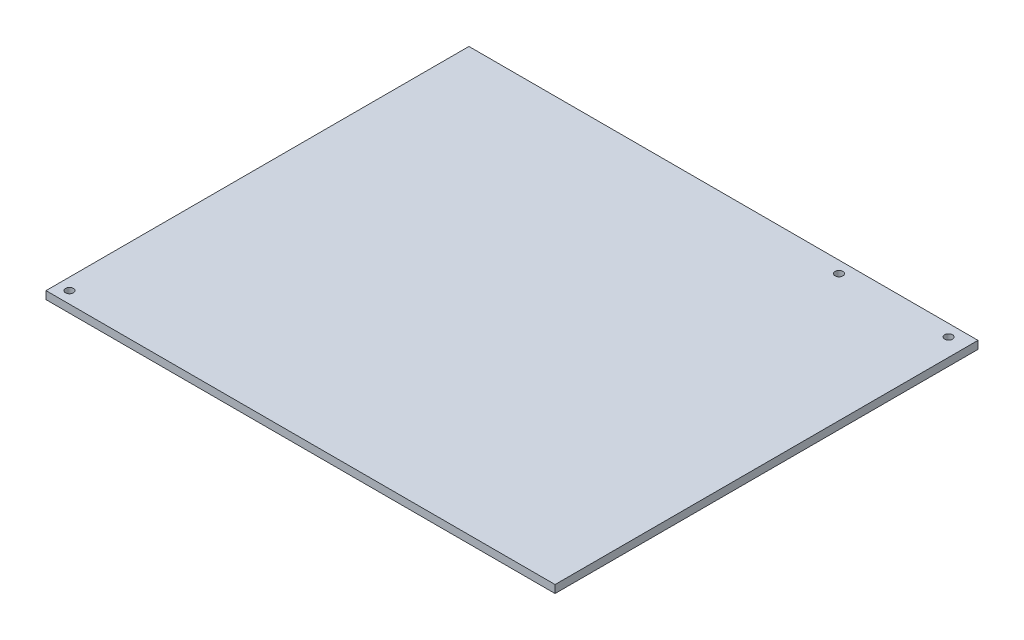
ISO-10303-21;
HEADER;
FILE_DESCRIPTION(('STEP AP214'),'2;1');
FILE_NAME('part.step','',(''),(''),'','','');
FILE_SCHEMA(('AUTOMOTIVE_DESIGN { 1 0 10303 214 1 1 1 1 }'));
ENDSEC;
DATA;
#1=APPLICATION_CONTEXT('core data for automotive mechanical design processes');
#2=APPLICATION_PROTOCOL_DEFINITION('international standard','automotive_design',2000,#1);
#3=PRODUCT_CONTEXT('',#1,'mechanical');
#4=PRODUCT('Part','Part','',(#3));
#5=PRODUCT_RELATED_PRODUCT_CATEGORY('part','',(#4));
#6=PRODUCT_DEFINITION_FORMATION('','',#4);
#7=PRODUCT_DEFINITION_CONTEXT('part definition',#1,'design');
#8=PRODUCT_DEFINITION('design','',#6,#7);
#9=PRODUCT_DEFINITION_SHAPE('','',#8);
#10=(LENGTH_UNIT() NAMED_UNIT(*) SI_UNIT(.MILLI.,.METRE.));
#11=(NAMED_UNIT(*) PLANE_ANGLE_UNIT() SI_UNIT($,.RADIAN.));
#12=(NAMED_UNIT(*) SI_UNIT($,.STERADIAN.) SOLID_ANGLE_UNIT());
#13=UNCERTAINTY_MEASURE_WITH_UNIT(LENGTH_MEASURE(1.E-05),#10,'distance_accuracy_value','');
#14=(GEOMETRIC_REPRESENTATION_CONTEXT(3) GLOBAL_UNCERTAINTY_ASSIGNED_CONTEXT((#13)) GLOBAL_UNIT_ASSIGNED_CONTEXT((#10,
#11,#12)) REPRESENTATION_CONTEXT('',''));
#15=CARTESIAN_POINT('',(0.,0.,0.));
#16=DIRECTION('',(0.,0.,1.));
#17=DIRECTION('',(1.,0.,0.));
#18=AXIS2_PLACEMENT_3D('',#15,#16,#17);
#19=CARTESIAN_POINT('',(0.,2.,0.));
#20=DIRECTION('',(0.,-1.,0.));
#21=DIRECTION('',(0.,0.,-1.));
#22=AXIS2_PLACEMENT_3D('',#19,#20,#21);
#23=PLANE('',#22);
#24=DIRECTION('',(0.,0.,1.));
#25=VECTOR('',#24,1.);
#26=CARTESIAN_POINT('',(0.,2.,0.));
#27=LINE('',#26,#25);
#28=CARTESIAN_POINT('',(0.,2.,-108.));
#29=VERTEX_POINT('',#28);
#30=CARTESIAN_POINT('',(0.,2.,0.));
#31=VERTEX_POINT('',#30);
#32=EDGE_CURVE('E92',#29,#31,#27,.T.);
#33=ORIENTED_EDGE('',*,*,#32,.T.);
#34=DIRECTION('',(1.,0.,0.));
#35=VECTOR('',#34,1.);
#36=CARTESIAN_POINT('',(0.,2.,0.));
#37=LINE('',#36,#35);
#38=CARTESIAN_POINT('',(130.,2.,0.));
#39=VERTEX_POINT('',#38);
#40=EDGE_CURVE('E87',#31,#39,#37,.T.);
#41=ORIENTED_EDGE('',*,*,#40,.T.);
#42=DIRECTION('',(0.,0.,-1.));
#43=VECTOR('',#42,1.);
#44=CARTESIAN_POINT('',(130.,2.,0.));
#45=LINE('',#44,#43);
#46=CARTESIAN_POINT('',(130.,2.,-108.));
#47=VERTEX_POINT('',#46);
#48=EDGE_CURVE('E90',#39,#47,#45,.T.);
#49=ORIENTED_EDGE('',*,*,#48,.T.);
#50=DIRECTION('',(-1.,0.,0.));
#51=VECTOR('',#50,1.);
#52=CARTESIAN_POINT('',(0.,2.,-108.));
#53=LINE('',#52,#51);
#54=EDGE_CURVE('E57',#47,#29,#53,.T.);
#55=ORIENTED_EDGE('',*,*,#54,.T.);
#56=EDGE_LOOP('',(#33,#41,#49,#55));
#57=FACE_BOUND('',#56,.T.);
#58=CARTESIAN_POINT('',(3.,2.,-3.));
#59=DIRECTION('',(0.,1.,0.));
#60=DIRECTION('',(0.,0.,1.));
#61=AXIS2_PLACEMENT_3D('',#58,#59,#60);
#62=CIRCLE('',#61,1.);
#63=CARTESIAN_POINT('',(3.,2.,-2.));
#64=VERTEX_POINT('',#63);
#65=EDGE_CURVE('E112',#64,#64,#62,.T.);
#66=ORIENTED_EDGE('',*,*,#65,.F.);
#67=EDGE_LOOP('',(#66));
#68=FACE_BOUND('',#67,.T.);
#69=CARTESIAN_POINT('',(125.5,2.,-105.));
#70=DIRECTION('',(0.,1.,0.));
#71=DIRECTION('',(0.,0.,1.));
#72=AXIS2_PLACEMENT_3D('',#69,#70,#71);
#73=CIRCLE('',#72,0.999999999999998);
#74=CARTESIAN_POINT('',(125.5,2.,-104.));
#75=VERTEX_POINT('',#74);
#76=EDGE_CURVE('E134',#75,#75,#73,.T.);
#77=ORIENTED_EDGE('',*,*,#76,.F.);
#78=EDGE_LOOP('',(#77));
#79=FACE_BOUND('',#78,.T.);
#80=CARTESIAN_POINT('',(97.5,2.,-105.));
#81=DIRECTION('',(0.,1.,0.));
#82=DIRECTION('',(0.,0.,1.));
#83=AXIS2_PLACEMENT_3D('',#80,#81,#82);
#84=CIRCLE('',#83,0.999999999999998);
#85=CARTESIAN_POINT('',(97.5,2.,-104.));
#86=VERTEX_POINT('',#85);
#87=EDGE_CURVE('E142',#86,#86,#84,.T.);
#88=ORIENTED_EDGE('',*,*,#87,.F.);
#89=EDGE_LOOP('',(#88));
#90=FACE_BOUND('',#89,.T.);
#91=ADVANCED_FACE('F39',(#57,#68,#79,#90),#23,.F.);
#92=CARTESIAN_POINT('',(0.,0.,0.));
#93=DIRECTION('',(0.,-1.,0.));
#94=DIRECTION('',(0.,0.,-1.));
#95=AXIS2_PLACEMENT_3D('',#92,#93,#94);
#96=PLANE('',#95);
#97=CARTESIAN_POINT('',(125.5,0.,-105.));
#98=DIRECTION('',(0.,1.,0.));
#99=DIRECTION('',(0.,0.,1.));
#100=AXIS2_PLACEMENT_3D('',#97,#98,#99);
#101=CIRCLE('',#100,0.999999999999998);
#102=CARTESIAN_POINT('',(125.5,0.,-104.));
#103=VERTEX_POINT('',#102);
#104=EDGE_CURVE('E138',#103,#103,#101,.T.);
#105=ORIENTED_EDGE('',*,*,#104,.T.);
#106=EDGE_LOOP('',(#105));
#107=FACE_BOUND('',#106,.T.);
#108=DIRECTION('',(0.,0.,1.));
#109=VECTOR('',#108,1.);
#110=CARTESIAN_POINT('',(0.,0.,0.));
#111=LINE('',#110,#109);
#112=CARTESIAN_POINT('',(0.,0.,-108.));
#113=VERTEX_POINT('',#112);
#114=CARTESIAN_POINT('',(0.,0.,0.));
#115=VERTEX_POINT('',#114);
#116=EDGE_CURVE('E108',#113,#115,#111,.T.);
#117=ORIENTED_EDGE('',*,*,#116,.F.);
#118=DIRECTION('',(-1.,0.,0.));
#119=VECTOR('',#118,1.);
#120=CARTESIAN_POINT('',(0.,0.,-108.));
#121=LINE('',#120,#119);
#122=CARTESIAN_POINT('',(130.,0.,-108.));
#123=VERTEX_POINT('',#122);
#124=EDGE_CURVE('E80',#123,#113,#121,.T.);
#125=ORIENTED_EDGE('',*,*,#124,.F.);
#126=DIRECTION('',(0.,0.,-1.));
#127=VECTOR('',#126,1.);
#128=CARTESIAN_POINT('',(130.,0.,0.));
#129=LINE('',#128,#127);
#130=CARTESIAN_POINT('',(130.,0.,0.));
#131=VERTEX_POINT('',#130);
#132=EDGE_CURVE('E74',#131,#123,#129,.T.);
#133=ORIENTED_EDGE('',*,*,#132,.F.);
#134=DIRECTION('',(1.,0.,0.));
#135=VECTOR('',#134,1.);
#136=CARTESIAN_POINT('',(0.,0.,0.));
#137=LINE('',#136,#135);
#138=EDGE_CURVE('E97',#115,#131,#137,.T.);
#139=ORIENTED_EDGE('',*,*,#138,.F.);
#140=EDGE_LOOP('',(#117,#125,#133,#139));
#141=FACE_BOUND('',#140,.T.);
#142=CARTESIAN_POINT('',(3.,0.,-3.));
#143=DIRECTION('',(0.,1.,0.));
#144=DIRECTION('',(0.,0.,1.));
#145=AXIS2_PLACEMENT_3D('',#142,#143,#144);
#146=CIRCLE('',#145,1.);
#147=CARTESIAN_POINT('',(3.,0.,-2.));
#148=VERTEX_POINT('',#147);
#149=EDGE_CURVE('E130',#148,#148,#146,.T.);
#150=ORIENTED_EDGE('',*,*,#149,.T.);
#151=EDGE_LOOP('',(#150));
#152=FACE_BOUND('',#151,.T.);
#153=CARTESIAN_POINT('',(97.5,0.,-105.));
#154=DIRECTION('',(0.,1.,0.));
#155=DIRECTION('',(0.,0.,1.));
#156=AXIS2_PLACEMENT_3D('',#153,#154,#155);
#157=CIRCLE('',#156,0.999999999999998);
#158=CARTESIAN_POINT('',(97.5,0.,-104.));
#159=VERTEX_POINT('',#158);
#160=EDGE_CURVE('E146',#159,#159,#157,.T.);
#161=ORIENTED_EDGE('',*,*,#160,.T.);
#162=EDGE_LOOP('',(#161));
#163=FACE_BOUND('',#162,.T.);
#164=ADVANCED_FACE('F125',(#107,#141,#152,#163),#96,.T.);
#165=CARTESIAN_POINT('',(0.,2.,0.));
#166=DIRECTION('',(1.,0.,0.));
#167=DIRECTION('',(0.,0.,-1.));
#168=AXIS2_PLACEMENT_3D('',#165,#166,#167);
#169=PLANE('',#168);
#170=ORIENTED_EDGE('',*,*,#116,.T.);
#171=DIRECTION('',(0.,-1.,0.));
#172=VECTOR('',#171,1.);
#173=CARTESIAN_POINT('',(0.,2.,0.));
#174=LINE('',#173,#172);
#175=EDGE_CURVE('E11',#31,#115,#174,.T.);
#176=ORIENTED_EDGE('',*,*,#175,.F.);
#177=ORIENTED_EDGE('',*,*,#32,.F.);
#178=DIRECTION('',(0.,-1.,0.));
#179=VECTOR('',#178,1.);
#180=CARTESIAN_POINT('',(0.,2.,-108.));
#181=LINE('',#180,#179);
#182=EDGE_CURVE('E104',#29,#113,#181,.T.);
#183=ORIENTED_EDGE('',*,*,#182,.T.);
#184=EDGE_LOOP('',(#170,#176,#177,#183));
#185=FACE_BOUND('',#184,.T.);
#186=ADVANCED_FACE('F41',(#185),#169,.F.);
#187=CARTESIAN_POINT('',(0.,2.,0.));
#188=DIRECTION('',(0.,0.,-1.));
#189=DIRECTION('',(-1.,0.,0.));
#190=AXIS2_PLACEMENT_3D('',#187,#188,#189);
#191=PLANE('',#190);
#192=ORIENTED_EDGE('',*,*,#138,.T.);
#193=DIRECTION('',(0.,-1.,0.));
#194=VECTOR('',#193,1.);
#195=CARTESIAN_POINT('',(130.,2.,0.));
#196=LINE('',#195,#194);
#197=EDGE_CURVE('E49',#39,#131,#196,.T.);
#198=ORIENTED_EDGE('',*,*,#197,.F.);
#199=ORIENTED_EDGE('',*,*,#40,.F.);
#200=ORIENTED_EDGE('',*,*,#175,.T.);
#201=EDGE_LOOP('',(#192,#198,#199,#200));
#202=FACE_BOUND('',#201,.T.);
#203=ADVANCED_FACE('F96',(#202),#191,.F.);
#204=CARTESIAN_POINT('',(130.,2.,0.));
#205=DIRECTION('',(-1.,0.,0.));
#206=DIRECTION('',(0.,0.,1.));
#207=AXIS2_PLACEMENT_3D('',#204,#205,#206);
#208=PLANE('',#207);
#209=ORIENTED_EDGE('',*,*,#132,.T.);
#210=DIRECTION('',(0.,-1.,0.));
#211=VECTOR('',#210,1.);
#212=CARTESIAN_POINT('',(130.,2.,-108.));
#213=LINE('',#212,#211);
#214=EDGE_CURVE('E99',#47,#123,#213,.T.);
#215=ORIENTED_EDGE('',*,*,#214,.F.);
#216=ORIENTED_EDGE('',*,*,#48,.F.);
#217=ORIENTED_EDGE('',*,*,#197,.T.);
#218=EDGE_LOOP('',(#209,#215,#216,#217));
#219=FACE_BOUND('',#218,.T.);
#220=ADVANCED_FACE('F100',(#219),#208,.F.);
#221=CARTESIAN_POINT('',(0.,2.,-108.));
#222=DIRECTION('',(0.,0.,1.));
#223=DIRECTION('',(1.,0.,0.));
#224=AXIS2_PLACEMENT_3D('',#221,#222,#223);
#225=PLANE('',#224);
#226=ORIENTED_EDGE('',*,*,#124,.T.);
#227=ORIENTED_EDGE('',*,*,#182,.F.);
#228=ORIENTED_EDGE('',*,*,#54,.F.);
#229=ORIENTED_EDGE('',*,*,#214,.T.);
#230=EDGE_LOOP('',(#226,#227,#228,#229));
#231=FACE_BOUND('',#230,.T.);
#232=ADVANCED_FACE('F122',(#231),#225,.F.);
#233=CARTESIAN_POINT('',(3.,2.,-3.));
#234=DIRECTION('',(0.,-1.,0.));
#235=DIRECTION('',(0.,0.,-1.));
#236=AXIS2_PLACEMENT_3D('',#233,#234,#235);
#237=CYLINDRICAL_SURFACE('',#236,1.);
#238=ORIENTED_EDGE('',*,*,#65,.T.);
#239=EDGE_LOOP('',(#238));
#240=FACE_BOUND('',#239,.T.);
#241=ORIENTED_EDGE('',*,*,#149,.F.);
#242=EDGE_LOOP('',(#241));
#243=FACE_BOUND('',#242,.T.);
#244=ADVANCED_FACE('F165',(#240,#243),#237,.F.);
#245=CARTESIAN_POINT('',(125.5,2.,-105.));
#246=DIRECTION('',(0.,-1.,0.));
#247=DIRECTION('',(0.,0.,-1.));
#248=AXIS2_PLACEMENT_3D('',#245,#246,#247);
#249=CYLINDRICAL_SURFACE('',#248,0.999999999999998);
#250=ORIENTED_EDGE('',*,*,#76,.T.);
#251=EDGE_LOOP('',(#250));
#252=FACE_BOUND('',#251,.T.);
#253=ORIENTED_EDGE('',*,*,#104,.F.);
#254=EDGE_LOOP('',(#253));
#255=FACE_BOUND('',#254,.T.);
#256=ADVANCED_FACE('F211',(#252,#255),#249,.F.);
#257=CARTESIAN_POINT('',(97.5,2.,-105.));
#258=DIRECTION('',(0.,-1.,0.));
#259=DIRECTION('',(0.,0.,-1.));
#260=AXIS2_PLACEMENT_3D('',#257,#258,#259);
#261=CYLINDRICAL_SURFACE('',#260,0.999999999999998);
#262=ORIENTED_EDGE('',*,*,#87,.T.);
#263=EDGE_LOOP('',(#262));
#264=FACE_BOUND('',#263,.T.);
#265=ORIENTED_EDGE('',*,*,#160,.F.);
#266=EDGE_LOOP('',(#265));
#267=FACE_BOUND('',#266,.T.);
#268=ADVANCED_FACE('F154',(#264,#267),#261,.F.);
#269=CLOSED_SHELL('',(#91,#164,#186,#203,#220,#232,#244,#256,#268));
#270=MANIFOLD_SOLID_BREP('B2',#269);
#271=ADVANCED_BREP_SHAPE_REPRESENTATION('',(#18,#270),#14);
#272=SHAPE_DEFINITION_REPRESENTATION(#9,#271);
ENDSEC;
END-ISO-10303-21;
